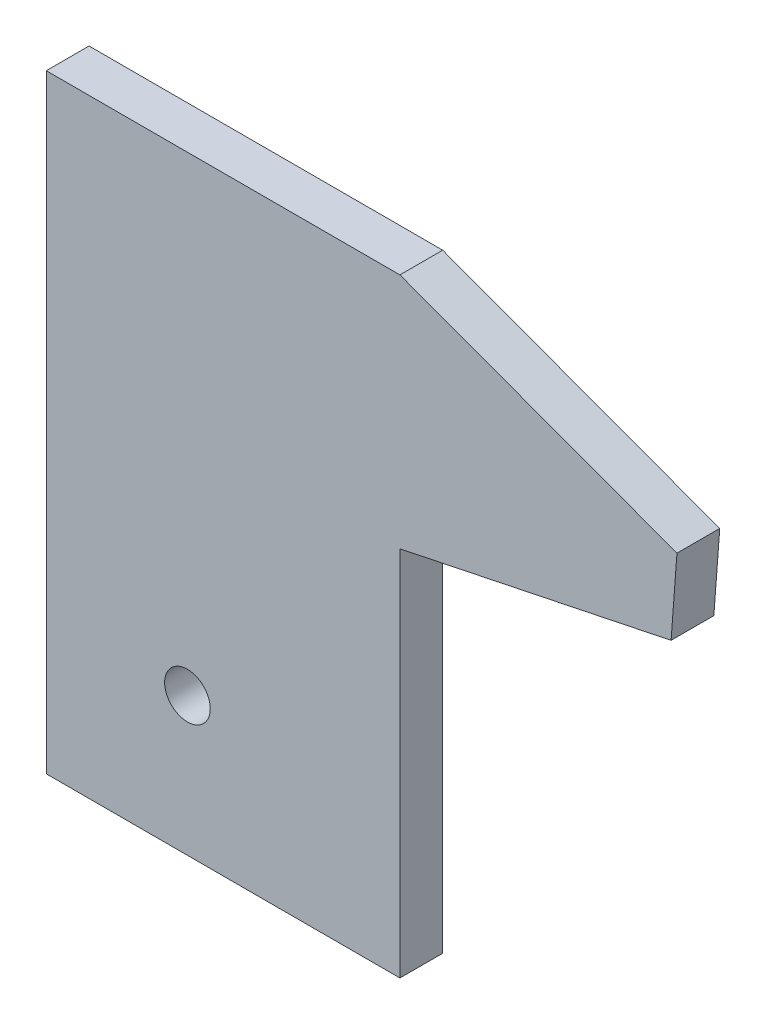
ISO-10303-21;
HEADER;
FILE_DESCRIPTION(('STEP AP214'),'2;1');
FILE_NAME('part.step','',(''),(''),'','','');
FILE_SCHEMA(('AUTOMOTIVE_DESIGN { 1 0 10303 214 1 1 1 1 }'));
ENDSEC;
DATA;
#1=APPLICATION_CONTEXT('core data for automotive mechanical design processes');
#2=APPLICATION_PROTOCOL_DEFINITION('international standard','automotive_design',2000,#1);
#3=PRODUCT_CONTEXT('',#1,'mechanical');
#4=PRODUCT('Part','Part','',(#3));
#5=PRODUCT_RELATED_PRODUCT_CATEGORY('part','',(#4));
#6=PRODUCT_DEFINITION_FORMATION('','',#4);
#7=PRODUCT_DEFINITION_CONTEXT('part definition',#1,'design');
#8=PRODUCT_DEFINITION('design','',#6,#7);
#9=PRODUCT_DEFINITION_SHAPE('','',#8);
#10=(LENGTH_UNIT() NAMED_UNIT(*) SI_UNIT(.MILLI.,.METRE.));
#11=(NAMED_UNIT(*) PLANE_ANGLE_UNIT() SI_UNIT($,.RADIAN.));
#12=(NAMED_UNIT(*) SI_UNIT($,.STERADIAN.) SOLID_ANGLE_UNIT());
#13=UNCERTAINTY_MEASURE_WITH_UNIT(LENGTH_MEASURE(1.E-05),#10,'distance_accuracy_value','');
#14=(GEOMETRIC_REPRESENTATION_CONTEXT(3) GLOBAL_UNCERTAINTY_ASSIGNED_CONTEXT((#13)) GLOBAL_UNIT_ASSIGNED_CONTEXT((#10,
#11,#12)) REPRESENTATION_CONTEXT('',''));
#15=CARTESIAN_POINT('',(0.,0.,0.));
#16=DIRECTION('',(0.,0.,1.));
#17=DIRECTION('',(1.,0.,0.));
#18=AXIS2_PLACEMENT_3D('',#15,#16,#17);
#19=CARTESIAN_POINT('',(0.,0.,3.));
#20=DIRECTION('',(0.,0.,1.));
#21=DIRECTION('',(1.,0.,0.));
#22=AXIS2_PLACEMENT_3D('',#19,#20,#21);
#23=PLANE('',#22);
#24=DIRECTION('',(0.,1.,0.));
#25=VECTOR('',#24,1.);
#26=CARTESIAN_POINT('',(-160.335655896636,-67.7000000000001,3.));
#27=LINE('',#26,#25);
#28=CARTESIAN_POINT('',(-160.335655896636,-67.7000000000001,3.));
#29=VERTEX_POINT('',#28);
#30=CARTESIAN_POINT('',(-160.335655896636,-41.6351945851151,3.));
#31=VERTEX_POINT('',#30);
#32=EDGE_CURVE('E139',#29,#31,#27,.T.);
#33=ORIENTED_EDGE('',*,*,#32,.T.);
#34=DIRECTION('',(0.979113237885743,0.203315684089785,0.));
#35=VECTOR('',#34,1.);
#36=CARTESIAN_POINT('',(-141.319826378506,-37.6865028123821,3.));
#37=LINE('',#36,#35);
#38=CARTESIAN_POINT('',(-141.319826378506,-37.6865028123821,3.));
#39=VERTEX_POINT('',#38);
#40=EDGE_CURVE('E92',#31,#39,#37,.T.);
#41=ORIENTED_EDGE('',*,*,#40,.T.);
#42=DIRECTION('',(0.0746689734861553,0.997208375615911,0.));
#43=VECTOR('',#42,1.);
#44=CARTESIAN_POINT('',(-140.907866476125,-32.1847549525689,3.));
#45=LINE('',#44,#43);
#46=CARTESIAN_POINT('',(-140.907866476125,-32.1847549525689,3.));
#47=VERTEX_POINT('',#46);
#48=EDGE_CURVE('E151',#39,#47,#45,.T.);
#49=ORIENTED_EDGE('',*,*,#48,.T.);
#50=DIRECTION('',(-0.937917247647678,0.346859101891538,0.));
#51=VECTOR('',#50,1.);
#52=CARTESIAN_POINT('',(-160.335655896636,-25.0000000000001,3.));
#53=LINE('',#52,#51);
#54=CARTESIAN_POINT('',(-160.335655896636,-25.0000000000001,3.));
#55=VERTEX_POINT('',#54);
#56=EDGE_CURVE('E108',#47,#55,#53,.T.);
#57=ORIENTED_EDGE('',*,*,#56,.T.);
#58=DIRECTION('',(-1.,0.,0.));
#59=VECTOR('',#58,1.);
#60=CARTESIAN_POINT('',(-160.335655896636,-25.0000000000001,3.));
#61=LINE('',#60,#59);
#62=CARTESIAN_POINT('',(-185.135655896636,-25.0000000000001,3.));
#63=VERTEX_POINT('',#62);
#64=EDGE_CURVE('E102',#55,#63,#61,.T.);
#65=ORIENTED_EDGE('',*,*,#64,.T.);
#66=DIRECTION('',(0.,-1.,0.));
#67=VECTOR('',#66,1.);
#68=CARTESIAN_POINT('',(-185.135655896636,-67.7000000000001,3.));
#69=LINE('',#68,#67);
#70=CARTESIAN_POINT('',(-185.135655896636,-67.7000000000001,3.));
#71=VERTEX_POINT('',#70);
#72=EDGE_CURVE('E106',#63,#71,#69,.T.);
#73=ORIENTED_EDGE('',*,*,#72,.T.);
#74=DIRECTION('',(1.,0.,0.));
#75=VECTOR('',#74,1.);
#76=CARTESIAN_POINT('',(-160.335655896636,-67.7000000000001,3.));
#77=LINE('',#76,#75);
#78=EDGE_CURVE('E52',#71,#29,#77,.T.);
#79=ORIENTED_EDGE('',*,*,#78,.T.);
#80=EDGE_LOOP('',(#33,#41,#49,#57,#65,#73,#79));
#81=FACE_BOUND('',#80,.T.);
#82=CARTESIAN_POINT('',(-175.235655896636,-58.0000000000001,3.));
#83=DIRECTION('',(0.,0.,1.));
#84=DIRECTION('',(1.,0.,0.));
#85=AXIS2_PLACEMENT_3D('',#82,#83,#84);
#86=CIRCLE('',#85,1.59999999999999);
#87=CARTESIAN_POINT('',(-173.635655896636,-58.0000000000001,3.));
#88=VERTEX_POINT('',#87);
#89=EDGE_CURVE('E130',#88,#88,#86,.T.);
#90=ORIENTED_EDGE('',*,*,#89,.F.);
#91=EDGE_LOOP('',(#90));
#92=FACE_BOUND('',#91,.T.);
#93=ADVANCED_FACE('F35',(#81,#92),#23,.T.);
#94=CARTESIAN_POINT('',(0.,0.,0.));
#95=DIRECTION('',(0.,0.,1.));
#96=DIRECTION('',(1.,0.,0.));
#97=AXIS2_PLACEMENT_3D('',#94,#95,#96);
#98=PLANE('',#97);
#99=DIRECTION('',(0.,1.,0.));
#100=VECTOR('',#99,1.);
#101=CARTESIAN_POINT('',(-160.335655896636,-67.7000000000001,0.));
#102=LINE('',#101,#100);
#103=CARTESIAN_POINT('',(-160.335655896636,-67.7000000000001,0.));
#104=VERTEX_POINT('',#103);
#105=CARTESIAN_POINT('',(-160.335655896636,-41.6351945851151,0.));
#106=VERTEX_POINT('',#105);
#107=EDGE_CURVE('E126',#104,#106,#102,.T.);
#108=ORIENTED_EDGE('',*,*,#107,.F.);
#109=DIRECTION('',(1.,0.,0.));
#110=VECTOR('',#109,1.);
#111=CARTESIAN_POINT('',(-160.335655896636,-67.7000000000001,0.));
#112=LINE('',#111,#110);
#113=CARTESIAN_POINT('',(-185.135655896636,-67.7000000000001,0.));
#114=VERTEX_POINT('',#113);
#115=EDGE_CURVE('E84',#114,#104,#112,.T.);
#116=ORIENTED_EDGE('',*,*,#115,.F.);
#117=DIRECTION('',(0.,-1.,0.));
#118=VECTOR('',#117,1.);
#119=CARTESIAN_POINT('',(-185.135655896636,-67.7000000000001,0.));
#120=LINE('',#119,#118);
#121=CARTESIAN_POINT('',(-185.135655896636,-25.0000000000001,0.));
#122=VERTEX_POINT('',#121);
#123=EDGE_CURVE('E78',#122,#114,#120,.T.);
#124=ORIENTED_EDGE('',*,*,#123,.F.);
#125=DIRECTION('',(-1.,0.,0.));
#126=VECTOR('',#125,1.);
#127=CARTESIAN_POINT('',(-160.335655896636,-25.0000000000001,0.));
#128=LINE('',#127,#126);
#129=CARTESIAN_POINT('',(-160.335655896636,-25.0000000000001,0.));
#130=VERTEX_POINT('',#129);
#131=EDGE_CURVE('E116',#130,#122,#128,.T.);
#132=ORIENTED_EDGE('',*,*,#131,.F.);
#133=DIRECTION('',(-0.937917247647678,0.346859101891538,0.));
#134=VECTOR('',#133,1.);
#135=CARTESIAN_POINT('',(-160.335655896636,-25.0000000000001,0.));
#136=LINE('',#135,#134);
#137=CARTESIAN_POINT('',(-140.907866476125,-32.1847549525689,0.));
#138=VERTEX_POINT('',#137);
#139=EDGE_CURVE('E134',#138,#130,#136,.T.);
#140=ORIENTED_EDGE('',*,*,#139,.F.);
#141=DIRECTION('',(0.0746689734861553,0.997208375615911,0.));
#142=VECTOR('',#141,1.);
#143=CARTESIAN_POINT('',(-140.907866476125,-32.1847549525689,0.));
#144=LINE('',#143,#142);
#145=CARTESIAN_POINT('',(-141.319826378506,-37.6865028123821,0.));
#146=VERTEX_POINT('',#145);
#147=EDGE_CURVE('E132',#146,#138,#144,.T.);
#148=ORIENTED_EDGE('',*,*,#147,.F.);
#149=DIRECTION('',(0.979113237885743,0.203315684089785,0.));
#150=VECTOR('',#149,1.);
#151=CARTESIAN_POINT('',(-141.319826378506,-37.6865028123821,0.));
#152=LINE('',#151,#150);
#153=EDGE_CURVE('E129',#106,#146,#152,.T.);
#154=ORIENTED_EDGE('',*,*,#153,.F.);
#155=EDGE_LOOP('',(#108,#116,#124,#132,#140,#148,#154));
#156=FACE_BOUND('',#155,.T.);
#157=CARTESIAN_POINT('',(-175.235655896636,-58.0000000000001,0.));
#158=DIRECTION('',(0.,0.,1.));
#159=DIRECTION('',(1.,0.,0.));
#160=AXIS2_PLACEMENT_3D('',#157,#158,#159);
#161=CIRCLE('',#160,1.59999999999999);
#162=CARTESIAN_POINT('',(-173.635655896636,-58.0000000000001,0.));
#163=VERTEX_POINT('',#162);
#164=EDGE_CURVE('E163',#163,#163,#161,.T.);
#165=ORIENTED_EDGE('',*,*,#164,.T.);
#166=EDGE_LOOP('',(#165));
#167=FACE_BOUND('',#166,.T.);
#168=ADVANCED_FACE('F155',(#156,#167),#98,.F.);
#169=CARTESIAN_POINT('',(-160.335655896636,-67.7000000000001,3.));
#170=DIRECTION('',(-1.,0.,0.));
#171=DIRECTION('',(0.,0.,1.));
#172=AXIS2_PLACEMENT_3D('',#169,#170,#171);
#173=PLANE('',#172);
#174=ORIENTED_EDGE('',*,*,#107,.T.);
#175=DIRECTION('',(0.,0.,-1.));
#176=VECTOR('',#175,1.);
#177=CARTESIAN_POINT('',(-160.335655896636,-41.6351945851151,3.));
#178=LINE('',#177,#176);
#179=EDGE_CURVE('E11',#31,#106,#178,.T.);
#180=ORIENTED_EDGE('',*,*,#179,.F.);
#181=ORIENTED_EDGE('',*,*,#32,.F.);
#182=DIRECTION('',(0.,0.,-1.));
#183=VECTOR('',#182,1.);
#184=CARTESIAN_POINT('',(-160.335655896636,-67.7000000000001,3.));
#185=LINE('',#184,#183);
#186=EDGE_CURVE('E122',#29,#104,#185,.T.);
#187=ORIENTED_EDGE('',*,*,#186,.T.);
#188=EDGE_LOOP('',(#174,#180,#181,#187));
#189=FACE_BOUND('',#188,.T.);
#190=ADVANCED_FACE('F37',(#189),#173,.F.);
#191=CARTESIAN_POINT('',(-141.319826378506,-37.6865028123821,3.));
#192=DIRECTION('',(-0.203315684089785,0.979113237885742,0.));
#193=DIRECTION('',(-0.979113237885743,-0.203315684089785,0.));
#194=AXIS2_PLACEMENT_3D('',#191,#192,#193);
#195=PLANE('',#194);
#196=ORIENTED_EDGE('',*,*,#153,.T.);
#197=DIRECTION('',(0.,0.,-1.));
#198=VECTOR('',#197,1.);
#199=CARTESIAN_POINT('',(-141.319826378506,-37.6865028123821,3.));
#200=LINE('',#199,#198);
#201=EDGE_CURVE('E44',#39,#146,#200,.T.);
#202=ORIENTED_EDGE('',*,*,#201,.F.);
#203=ORIENTED_EDGE('',*,*,#40,.F.);
#204=ORIENTED_EDGE('',*,*,#179,.T.);
#205=EDGE_LOOP('',(#196,#202,#203,#204));
#206=FACE_BOUND('',#205,.T.);
#207=ADVANCED_FACE('F189',(#206),#195,.F.);
#208=CARTESIAN_POINT('',(-140.907866476125,-32.1847549525689,3.));
#209=DIRECTION('',(-0.997208375615911,0.0746689734861554,0.));
#210=DIRECTION('',(-0.0746689734861554,-0.997208375615911,0.));
#211=AXIS2_PLACEMENT_3D('',#208,#209,#210);
#212=PLANE('',#211);
#213=ORIENTED_EDGE('',*,*,#147,.T.);
#214=DIRECTION('',(0.,0.,-1.));
#215=VECTOR('',#214,1.);
#216=CARTESIAN_POINT('',(-140.907866476125,-32.1847549525689,3.));
#217=LINE('',#216,#215);
#218=EDGE_CURVE('E143',#47,#138,#217,.T.);
#219=ORIENTED_EDGE('',*,*,#218,.F.);
#220=ORIENTED_EDGE('',*,*,#48,.F.);
#221=ORIENTED_EDGE('',*,*,#201,.T.);
#222=EDGE_LOOP('',(#213,#219,#220,#221));
#223=FACE_BOUND('',#222,.T.);
#224=ADVANCED_FACE('F149',(#223),#212,.F.);
#225=CARTESIAN_POINT('',(-160.335655896636,-25.0000000000001,3.));
#226=DIRECTION('',(-0.346859101891538,-0.937917247647678,0.));
#227=DIRECTION('',(0.937917247647678,-0.346859101891538,0.));
#228=AXIS2_PLACEMENT_3D('',#225,#226,#227);
#229=PLANE('',#228);
#230=ORIENTED_EDGE('',*,*,#139,.T.);
#231=DIRECTION('',(0.,0.,-1.));
#232=VECTOR('',#231,1.);
#233=CARTESIAN_POINT('',(-160.335655896636,-25.0000000000001,3.));
#234=LINE('',#233,#232);
#235=EDGE_CURVE('E117',#55,#130,#234,.T.);
#236=ORIENTED_EDGE('',*,*,#235,.F.);
#237=ORIENTED_EDGE('',*,*,#56,.F.);
#238=ORIENTED_EDGE('',*,*,#218,.T.);
#239=EDGE_LOOP('',(#230,#236,#237,#238));
#240=FACE_BOUND('',#239,.T.);
#241=ADVANCED_FACE('F158',(#240),#229,.F.);
#242=CARTESIAN_POINT('',(-160.335655896636,-25.0000000000001,3.));
#243=DIRECTION('',(0.,-1.,0.));
#244=DIRECTION('',(1.,0.,0.));
#245=AXIS2_PLACEMENT_3D('',#242,#243,#244);
#246=PLANE('',#245);
#247=ORIENTED_EDGE('',*,*,#131,.T.);
#248=DIRECTION('',(0.,0.,-1.));
#249=VECTOR('',#248,1.);
#250=CARTESIAN_POINT('',(-185.135655896636,-25.0000000000001,3.));
#251=LINE('',#250,#249);
#252=EDGE_CURVE('E113',#63,#122,#251,.T.);
#253=ORIENTED_EDGE('',*,*,#252,.F.);
#254=ORIENTED_EDGE('',*,*,#64,.F.);
#255=ORIENTED_EDGE('',*,*,#235,.T.);
#256=EDGE_LOOP('',(#247,#253,#254,#255));
#257=FACE_BOUND('',#256,.T.);
#258=ADVANCED_FACE('F114',(#257),#246,.F.);
#259=CARTESIAN_POINT('',(-185.135655896636,-67.7000000000001,3.));
#260=DIRECTION('',(1.,0.,0.));
#261=DIRECTION('',(0.,0.,-1.));
#262=AXIS2_PLACEMENT_3D('',#259,#260,#261);
#263=PLANE('',#262);
#264=ORIENTED_EDGE('',*,*,#123,.T.);
#265=DIRECTION('',(0.,0.,-1.));
#266=VECTOR('',#265,1.);
#267=CARTESIAN_POINT('',(-185.135655896636,-67.7000000000001,3.));
#268=LINE('',#267,#266);
#269=EDGE_CURVE('E118',#71,#114,#268,.T.);
#270=ORIENTED_EDGE('',*,*,#269,.F.);
#271=ORIENTED_EDGE('',*,*,#72,.F.);
#272=ORIENTED_EDGE('',*,*,#252,.T.);
#273=EDGE_LOOP('',(#264,#270,#271,#272));
#274=FACE_BOUND('',#273,.T.);
#275=ADVANCED_FACE('F120',(#274),#263,.F.);
#276=CARTESIAN_POINT('',(-160.335655896636,-67.7000000000001,3.));
#277=DIRECTION('',(0.,1.,0.));
#278=DIRECTION('',(0.,0.,1.));
#279=AXIS2_PLACEMENT_3D('',#276,#277,#278);
#280=PLANE('',#279);
#281=ORIENTED_EDGE('',*,*,#115,.T.);
#282=ORIENTED_EDGE('',*,*,#186,.F.);
#283=ORIENTED_EDGE('',*,*,#78,.F.);
#284=ORIENTED_EDGE('',*,*,#269,.T.);
#285=EDGE_LOOP('',(#281,#282,#283,#284));
#286=FACE_BOUND('',#285,.T.);
#287=ADVANCED_FACE('F179',(#286),#280,.F.);
#288=CARTESIAN_POINT('',(-175.235655896636,-58.0000000000001,3.));
#289=DIRECTION('',(0.,0.,-1.));
#290=DIRECTION('',(-1.,0.,0.));
#291=AXIS2_PLACEMENT_3D('',#288,#289,#290);
#292=CYLINDRICAL_SURFACE('',#291,1.59999999999999);
#293=ORIENTED_EDGE('',*,*,#89,.T.);
#294=EDGE_LOOP('',(#293));
#295=FACE_BOUND('',#294,.T.);
#296=ORIENTED_EDGE('',*,*,#164,.F.);
#297=EDGE_LOOP('',(#296));
#298=FACE_BOUND('',#297,.T.);
#299=ADVANCED_FACE('F169',(#295,#298),#292,.F.);
#300=CLOSED_SHELL('',(#93,#168,#190,#207,#224,#241,#258,#275,#287,#299));
#301=MANIFOLD_SOLID_BREP('B2',#300);
#302=ADVANCED_BREP_SHAPE_REPRESENTATION('',(#18,#301),#14);
#303=SHAPE_DEFINITION_REPRESENTATION(#9,#302);
ENDSEC;
END-ISO-10303-21;
